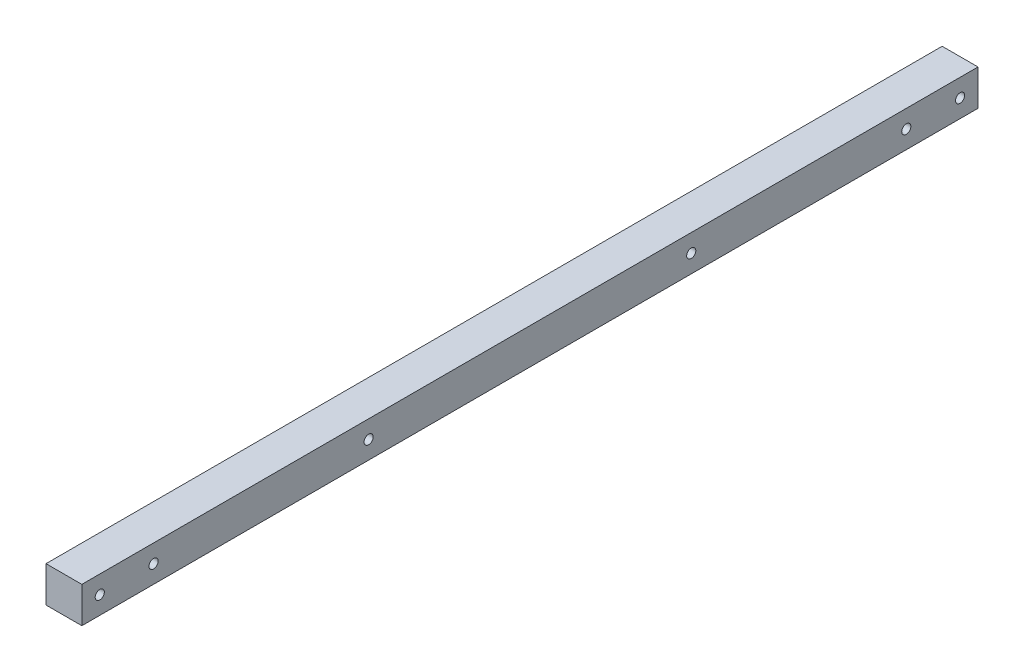
ISO-10303-21;
HEADER;
FILE_DESCRIPTION(('STEP AP214'),'2;1');
FILE_NAME('part.step','',(''),(''),'','','');
FILE_SCHEMA(('AUTOMOTIVE_DESIGN { 1 0 10303 214 1 1 1 1 }'));
ENDSEC;
DATA;
#1=APPLICATION_CONTEXT('core data for automotive mechanical design processes');
#2=APPLICATION_PROTOCOL_DEFINITION('international standard','automotive_design',2000,#1);
#3=PRODUCT_CONTEXT('',#1,'mechanical');
#4=PRODUCT('Part','Part','',(#3));
#5=PRODUCT_RELATED_PRODUCT_CATEGORY('part','',(#4));
#6=PRODUCT_DEFINITION_FORMATION('','',#4);
#7=PRODUCT_DEFINITION_CONTEXT('part definition',#1,'design');
#8=PRODUCT_DEFINITION('design','',#6,#7);
#9=PRODUCT_DEFINITION_SHAPE('','',#8);
#10=(LENGTH_UNIT() NAMED_UNIT(*) SI_UNIT(.MILLI.,.METRE.));
#11=(NAMED_UNIT(*) PLANE_ANGLE_UNIT() SI_UNIT($,.RADIAN.));
#12=(NAMED_UNIT(*) SI_UNIT($,.STERADIAN.) SOLID_ANGLE_UNIT());
#13=UNCERTAINTY_MEASURE_WITH_UNIT(LENGTH_MEASURE(1.E-05),#10,'distance_accuracy_value','');
#14=(GEOMETRIC_REPRESENTATION_CONTEXT(3) GLOBAL_UNCERTAINTY_ASSIGNED_CONTEXT((#13)) GLOBAL_UNIT_ASSIGNED_CONTEXT((#10,
#11,#12)) REPRESENTATION_CONTEXT('',''));
#15=CARTESIAN_POINT('',(0.,0.,0.));
#16=DIRECTION('',(0.,0.,1.));
#17=DIRECTION('',(1.,0.,0.));
#18=AXIS2_PLACEMENT_3D('',#15,#16,#17);
#19=CARTESIAN_POINT('',(-10.,-10.,500.));
#20=DIRECTION('',(0.,1.,0.));
#21=DIRECTION('',(0.,0.,1.));
#22=AXIS2_PLACEMENT_3D('',#19,#20,#21);
#23=PLANE('',#22);
#24=DIRECTION('',(0.,0.,-1.));
#25=VECTOR('',#24,1.);
#26=CARTESIAN_POINT('',(10.,-10.,500.));
#27=LINE('',#26,#25);
#28=CARTESIAN_POINT('',(10.,-10.,500.));
#29=VERTEX_POINT('',#28);
#30=CARTESIAN_POINT('',(10.,-10.,0.));
#31=VERTEX_POINT('',#30);
#32=EDGE_CURVE('E72',#29,#31,#27,.T.);
#33=ORIENTED_EDGE('',*,*,#32,.F.);
#34=DIRECTION('',(1.,0.,0.));
#35=VECTOR('',#34,1.);
#36=CARTESIAN_POINT('',(-240.,-10.,500.));
#37=LINE('',#36,#35);
#38=CARTESIAN_POINT('',(-10.,-10.,500.));
#39=VERTEX_POINT('',#38);
#40=EDGE_CURVE('E85',#39,#29,#37,.T.);
#41=ORIENTED_EDGE('',*,*,#40,.F.);
#42=DIRECTION('',(0.,0.,-1.));
#43=VECTOR('',#42,1.);
#44=CARTESIAN_POINT('',(-10.,-10.,500.));
#45=LINE('',#44,#43);
#46=CARTESIAN_POINT('',(-10.,-10.,0.));
#47=VERTEX_POINT('',#46);
#48=EDGE_CURVE('E78',#39,#47,#45,.T.);
#49=ORIENTED_EDGE('',*,*,#48,.T.);
#50=DIRECTION('',(1.,0.,0.));
#51=VECTOR('',#50,1.);
#52=CARTESIAN_POINT('',(-240.,-10.,0.));
#53=LINE('',#52,#51);
#54=EDGE_CURVE('E82',#47,#31,#53,.T.);
#55=ORIENTED_EDGE('',*,*,#54,.T.);
#56=EDGE_LOOP('',(#33,#41,#49,#55));
#57=FACE_BOUND('',#56,.T.);
#58=ADVANCED_FACE('F33',(#57),#23,.F.);
#59=CARTESIAN_POINT('',(10.,10.,500.));
#60=DIRECTION('',(-1.,0.,0.));
#61=DIRECTION('',(0.,0.,1.));
#62=AXIS2_PLACEMENT_3D('',#59,#60,#61);
#63=PLANE('',#62);
#64=CARTESIAN_POINT('',(10.,0.,160.));
#65=DIRECTION('',(1.,0.,0.));
#66=DIRECTION('',(0.,0.,-1.));
#67=AXIS2_PLACEMENT_3D('',#64,#65,#66);
#68=CIRCLE('',#67,2.54999999999999);
#69=CARTESIAN_POINT('',(9.99999999999999,0.,157.45));
#70=VERTEX_POINT('',#69);
#71=EDGE_CURVE('E140',#70,#70,#68,.T.);
#72=ORIENTED_EDGE('',*,*,#71,.F.);
#73=EDGE_LOOP('',(#72));
#74=FACE_BOUND('',#73,.T.);
#75=CARTESIAN_POINT('',(10.,0.,340.));
#76=DIRECTION('',(1.,0.,0.));
#77=DIRECTION('',(0.,0.,-1.));
#78=AXIS2_PLACEMENT_3D('',#75,#76,#77);
#79=CIRCLE('',#78,2.54999999999999);
#80=CARTESIAN_POINT('',(9.99999999999999,0.,337.45));
#81=VERTEX_POINT('',#80);
#82=EDGE_CURVE('E134',#81,#81,#79,.T.);
#83=ORIENTED_EDGE('',*,*,#82,.F.);
#84=EDGE_LOOP('',(#83));
#85=FACE_BOUND('',#84,.T.);
#86=CARTESIAN_POINT('',(10.,0.,40.));
#87=DIRECTION('',(1.,0.,0.));
#88=DIRECTION('',(0.,0.,-1.));
#89=AXIS2_PLACEMENT_3D('',#86,#87,#88);
#90=CIRCLE('',#89,2.55);
#91=CARTESIAN_POINT('',(10.,0.,37.45));
#92=VERTEX_POINT('',#91);
#93=EDGE_CURVE('E103',#92,#92,#90,.T.);
#94=ORIENTED_EDGE('',*,*,#93,.F.);
#95=EDGE_LOOP('',(#94));
#96=FACE_BOUND('',#95,.T.);
#97=CARTESIAN_POINT('',(10.,0.,10.));
#98=DIRECTION('',(1.,0.,0.));
#99=DIRECTION('',(0.,0.,-1.));
#100=AXIS2_PLACEMENT_3D('',#97,#98,#99);
#101=CIRCLE('',#100,2.55);
#102=CARTESIAN_POINT('',(10.,0.,7.45));
#103=VERTEX_POINT('',#102);
#104=EDGE_CURVE('E125',#103,#103,#101,.T.);
#105=ORIENTED_EDGE('',*,*,#104,.F.);
#106=EDGE_LOOP('',(#105));
#107=FACE_BOUND('',#106,.T.);
#108=CARTESIAN_POINT('',(10.,0.,460.));
#109=DIRECTION('',(1.,0.,0.));
#110=DIRECTION('',(0.,0.,-1.));
#111=AXIS2_PLACEMENT_3D('',#108,#109,#110);
#112=CIRCLE('',#111,2.54999999999999);
#113=CARTESIAN_POINT('',(10.,0.,457.45));
#114=VERTEX_POINT('',#113);
#115=EDGE_CURVE('E118',#114,#114,#112,.T.);
#116=ORIENTED_EDGE('',*,*,#115,.F.);
#117=EDGE_LOOP('',(#116));
#118=FACE_BOUND('',#117,.T.);
#119=CARTESIAN_POINT('',(10.,0.,490.));
#120=DIRECTION('',(1.,0.,0.));
#121=DIRECTION('',(0.,0.,-1.));
#122=AXIS2_PLACEMENT_3D('',#119,#120,#121);
#123=CIRCLE('',#122,2.54999999999999);
#124=CARTESIAN_POINT('',(10.,0.,487.45));
#125=VERTEX_POINT('',#124);
#126=EDGE_CURVE('E112',#125,#125,#123,.T.);
#127=ORIENTED_EDGE('',*,*,#126,.F.);
#128=EDGE_LOOP('',(#127));
#129=FACE_BOUND('',#128,.T.);
#130=ORIENTED_EDGE('',*,*,#32,.T.);
#131=DIRECTION('',(0.,1.,0.));
#132=VECTOR('',#131,1.);
#133=CARTESIAN_POINT('',(10.,10.,0.));
#134=LINE('',#133,#132);
#135=CARTESIAN_POINT('',(10.,10.,0.));
#136=VERTEX_POINT('',#135);
#137=EDGE_CURVE('E55',#31,#136,#134,.T.);
#138=ORIENTED_EDGE('',*,*,#137,.T.);
#139=DIRECTION('',(0.,0.,-1.));
#140=VECTOR('',#139,1.);
#141=CARTESIAN_POINT('',(10.,10.,500.));
#142=LINE('',#141,#140);
#143=CARTESIAN_POINT('',(10.,10.,500.));
#144=VERTEX_POINT('',#143);
#145=EDGE_CURVE('E11',#144,#136,#142,.T.);
#146=ORIENTED_EDGE('',*,*,#145,.F.);
#147=DIRECTION('',(0.,1.,0.));
#148=VECTOR('',#147,1.);
#149=CARTESIAN_POINT('',(10.,10.,500.));
#150=LINE('',#149,#148);
#151=EDGE_CURVE('E74',#29,#144,#150,.T.);
#152=ORIENTED_EDGE('',*,*,#151,.F.);
#153=EDGE_LOOP('',(#130,#138,#146,#152));
#154=FACE_BOUND('',#153,.T.);
#155=ADVANCED_FACE('F35',(#74,#85,#96,#107,#118,#129,#154),#63,.F.);
#156=CARTESIAN_POINT('',(-10.,10.,500.));
#157=DIRECTION('',(0.,-1.,0.));
#158=DIRECTION('',(0.,0.,-1.));
#159=AXIS2_PLACEMENT_3D('',#156,#157,#158);
#160=PLANE('',#159);
#161=DIRECTION('',(0.,0.,-1.));
#162=VECTOR('',#161,1.);
#163=CARTESIAN_POINT('',(-10.,10.,500.));
#164=LINE('',#163,#162);
#165=CARTESIAN_POINT('',(-10.,10.,500.));
#166=VERTEX_POINT('',#165);
#167=CARTESIAN_POINT('',(-10.,10.,0.));
#168=VERTEX_POINT('',#167);
#169=EDGE_CURVE('E41',#166,#168,#164,.T.);
#170=ORIENTED_EDGE('',*,*,#169,.F.);
#171=DIRECTION('',(-1.,0.,0.));
#172=VECTOR('',#171,1.);
#173=CARTESIAN_POINT('',(-10.,10.,500.));
#174=LINE('',#173,#172);
#175=EDGE_CURVE('E91',#144,#166,#174,.T.);
#176=ORIENTED_EDGE('',*,*,#175,.F.);
#177=ORIENTED_EDGE('',*,*,#145,.T.);
#178=DIRECTION('',(-1.,0.,0.));
#179=VECTOR('',#178,1.);
#180=CARTESIAN_POINT('',(-10.,10.,0.));
#181=LINE('',#180,#179);
#182=EDGE_CURVE('E90',#136,#168,#181,.T.);
#183=ORIENTED_EDGE('',*,*,#182,.T.);
#184=EDGE_LOOP('',(#170,#176,#177,#183));
#185=FACE_BOUND('',#184,.T.);
#186=ADVANCED_FACE('F149',(#185),#160,.F.);
#187=CARTESIAN_POINT('',(-10.,10.,500.));
#188=DIRECTION('',(1.,0.,0.));
#189=DIRECTION('',(0.,1.,0.));
#190=AXIS2_PLACEMENT_3D('',#187,#188,#189);
#191=PLANE('',#190);
#192=CARTESIAN_POINT('',(-10.,0.,160.));
#193=DIRECTION('',(1.,0.,0.));
#194=DIRECTION('',(0.,1.,0.));
#195=AXIS2_PLACEMENT_3D('',#192,#193,#194);
#196=CIRCLE('',#195,2.54999999999999);
#197=CARTESIAN_POINT('',(-10.,0.,157.45));
#198=VERTEX_POINT('',#197);
#199=EDGE_CURVE('E137',#198,#198,#196,.F.);
#200=ORIENTED_EDGE('',*,*,#199,.F.);
#201=EDGE_LOOP('',(#200));
#202=FACE_BOUND('',#201,.T.);
#203=CARTESIAN_POINT('',(-10.,0.,340.));
#204=DIRECTION('',(1.,0.,0.));
#205=DIRECTION('',(0.,1.,0.));
#206=AXIS2_PLACEMENT_3D('',#203,#204,#205);
#207=CIRCLE('',#206,2.54999999999999);
#208=CARTESIAN_POINT('',(-10.,0.,337.45));
#209=VERTEX_POINT('',#208);
#210=EDGE_CURVE('E86',#209,#209,#207,.F.);
#211=ORIENTED_EDGE('',*,*,#210,.F.);
#212=EDGE_LOOP('',(#211));
#213=FACE_BOUND('',#212,.T.);
#214=CARTESIAN_POINT('',(-10.,0.,40.));
#215=DIRECTION('',(1.,0.,0.));
#216=DIRECTION('',(0.,1.,0.));
#217=AXIS2_PLACEMENT_3D('',#214,#215,#216);
#218=CIRCLE('',#217,2.55);
#219=CARTESIAN_POINT('',(-10.,2.55,40.));
#220=VERTEX_POINT('',#219);
#221=EDGE_CURVE('E122',#220,#220,#218,.F.);
#222=ORIENTED_EDGE('',*,*,#221,.F.);
#223=EDGE_LOOP('',(#222));
#224=FACE_BOUND('',#223,.T.);
#225=CARTESIAN_POINT('',(-10.,0.,10.));
#226=DIRECTION('',(1.,0.,0.));
#227=DIRECTION('',(0.,1.,0.));
#228=AXIS2_PLACEMENT_3D('',#225,#226,#227);
#229=CIRCLE('',#228,2.55);
#230=CARTESIAN_POINT('',(-10.,2.55,10.));
#231=VERTEX_POINT('',#230);
#232=EDGE_CURVE('E121',#231,#231,#229,.F.);
#233=ORIENTED_EDGE('',*,*,#232,.F.);
#234=EDGE_LOOP('',(#233));
#235=FACE_BOUND('',#234,.T.);
#236=CARTESIAN_POINT('',(-10.,0.,460.));
#237=DIRECTION('',(1.,0.,0.));
#238=DIRECTION('',(0.,1.,0.));
#239=AXIS2_PLACEMENT_3D('',#236,#237,#238);
#240=CIRCLE('',#239,2.54999999999999);
#241=CARTESIAN_POINT('',(-10.,2.54999999999999,460.));
#242=VERTEX_POINT('',#241);
#243=EDGE_CURVE('E115',#242,#242,#240,.F.);
#244=ORIENTED_EDGE('',*,*,#243,.F.);
#245=EDGE_LOOP('',(#244));
#246=FACE_BOUND('',#245,.T.);
#247=CARTESIAN_POINT('',(-10.,0.,490.));
#248=DIRECTION('',(1.,0.,0.));
#249=DIRECTION('',(0.,1.,0.));
#250=AXIS2_PLACEMENT_3D('',#247,#248,#249);
#251=CIRCLE('',#250,2.54999999999999);
#252=CARTESIAN_POINT('',(-10.,2.54999999999999,490.));
#253=VERTEX_POINT('',#252);
#254=EDGE_CURVE('E107',#253,#253,#251,.F.);
#255=ORIENTED_EDGE('',*,*,#254,.F.);
#256=EDGE_LOOP('',(#255));
#257=FACE_BOUND('',#256,.T.);
#258=DIRECTION('',(0.,-1.,0.));
#259=VECTOR('',#258,1.);
#260=CARTESIAN_POINT('',(-10.,10.,0.));
#261=LINE('',#260,#259);
#262=EDGE_CURVE('E79',#168,#47,#261,.T.);
#263=ORIENTED_EDGE('',*,*,#262,.T.);
#264=ORIENTED_EDGE('',*,*,#48,.F.);
#265=DIRECTION('',(0.,-1.,0.));
#266=VECTOR('',#265,1.);
#267=CARTESIAN_POINT('',(-10.,10.,500.));
#268=LINE('',#267,#266);
#269=EDGE_CURVE('E95',#166,#39,#268,.T.);
#270=ORIENTED_EDGE('',*,*,#269,.F.);
#271=ORIENTED_EDGE('',*,*,#169,.T.);
#272=EDGE_LOOP('',(#263,#264,#270,#271));
#273=FACE_BOUND('',#272,.T.);
#274=ADVANCED_FACE('F100',(#202,#213,#224,#235,#246,#257,#273),#191,.F.);
#275=CARTESIAN_POINT('',(0.,0.,0.));
#276=DIRECTION('',(0.,0.,1.));
#277=DIRECTION('',(1.,0.,0.));
#278=AXIS2_PLACEMENT_3D('',#275,#276,#277);
#279=PLANE('',#278);
#280=ORIENTED_EDGE('',*,*,#137,.F.);
#281=ORIENTED_EDGE('',*,*,#54,.F.);
#282=ORIENTED_EDGE('',*,*,#262,.F.);
#283=ORIENTED_EDGE('',*,*,#182,.F.);
#284=EDGE_LOOP('',(#280,#281,#282,#283));
#285=FACE_BOUND('',#284,.T.);
#286=ADVANCED_FACE('F89',(#285),#279,.F.);
#287=CARTESIAN_POINT('',(0.,0.,500.));
#288=DIRECTION('',(0.,0.,-1.));
#289=DIRECTION('',(1.,0.,0.));
#290=AXIS2_PLACEMENT_3D('',#287,#288,#289);
#291=PLANE('',#290);
#292=ORIENTED_EDGE('',*,*,#269,.T.);
#293=ORIENTED_EDGE('',*,*,#40,.T.);
#294=ORIENTED_EDGE('',*,*,#151,.T.);
#295=ORIENTED_EDGE('',*,*,#175,.T.);
#296=EDGE_LOOP('',(#292,#293,#294,#295));
#297=FACE_BOUND('',#296,.T.);
#298=ADVANCED_FACE('F105',(#297),#291,.F.);
#299=CARTESIAN_POINT('',(-10.001,0.,490.));
#300=DIRECTION('',(1.,0.,0.));
#301=DIRECTION('',(0.,0.,-1.));
#302=AXIS2_PLACEMENT_3D('',#299,#300,#301);
#303=CYLINDRICAL_SURFACE('',#302,2.54999999999999);
#304=ORIENTED_EDGE('',*,*,#126,.T.);
#305=EDGE_LOOP('',(#304));
#306=FACE_BOUND('',#305,.T.);
#307=ORIENTED_EDGE('',*,*,#254,.T.);
#308=EDGE_LOOP('',(#307));
#309=FACE_BOUND('',#308,.T.);
#310=ADVANCED_FACE('F160',(#306,#309),#303,.F.);
#311=CARTESIAN_POINT('',(-10.001,0.,460.));
#312=DIRECTION('',(1.,0.,0.));
#313=DIRECTION('',(0.,0.,-1.));
#314=AXIS2_PLACEMENT_3D('',#311,#312,#313);
#315=CYLINDRICAL_SURFACE('',#314,2.54999999999999);
#316=ORIENTED_EDGE('',*,*,#115,.T.);
#317=EDGE_LOOP('',(#316));
#318=FACE_BOUND('',#317,.T.);
#319=ORIENTED_EDGE('',*,*,#243,.T.);
#320=EDGE_LOOP('',(#319));
#321=FACE_BOUND('',#320,.T.);
#322=ADVANCED_FACE('F163',(#318,#321),#315,.F.);
#323=CARTESIAN_POINT('',(-10.001,0.,10.));
#324=DIRECTION('',(1.,0.,0.));
#325=DIRECTION('',(0.,0.,-1.));
#326=AXIS2_PLACEMENT_3D('',#323,#324,#325);
#327=CYLINDRICAL_SURFACE('',#326,2.55);
#328=ORIENTED_EDGE('',*,*,#104,.T.);
#329=EDGE_LOOP('',(#328));
#330=FACE_BOUND('',#329,.T.);
#331=ORIENTED_EDGE('',*,*,#232,.T.);
#332=EDGE_LOOP('',(#331));
#333=FACE_BOUND('',#332,.T.);
#334=ADVANCED_FACE('F190',(#330,#333),#327,.F.);
#335=CARTESIAN_POINT('',(-10.001,0.,40.));
#336=DIRECTION('',(1.,0.,0.));
#337=DIRECTION('',(0.,0.,-1.));
#338=AXIS2_PLACEMENT_3D('',#335,#336,#337);
#339=CYLINDRICAL_SURFACE('',#338,2.55);
#340=ORIENTED_EDGE('',*,*,#93,.T.);
#341=EDGE_LOOP('',(#340));
#342=FACE_BOUND('',#341,.T.);
#343=ORIENTED_EDGE('',*,*,#221,.T.);
#344=EDGE_LOOP('',(#343));
#345=FACE_BOUND('',#344,.T.);
#346=ADVANCED_FACE('F192',(#342,#345),#339,.F.);
#347=CARTESIAN_POINT('',(-10.001,0.,340.));
#348=DIRECTION('',(1.,0.,0.));
#349=DIRECTION('',(0.,0.,-1.));
#350=AXIS2_PLACEMENT_3D('',#347,#348,#349);
#351=CYLINDRICAL_SURFACE('',#350,2.54999999999999);
#352=CARTESIAN_POINT('',(9.99999999999999,0.,337.45));
#353=CARTESIAN_POINT('',(9.79166666666666,0.,337.45));
#354=CARTESIAN_POINT('',(9.58333333333333,0.,337.45));
#355=CARTESIAN_POINT('',(9.16666666666666,0.,337.45));
#356=CARTESIAN_POINT('',(8.95833333333333,0.,337.45));
#357=CARTESIAN_POINT('',(8.54166666666666,0.,337.45));
#358=CARTESIAN_POINT('',(8.33333333333333,0.,337.45));
#359=CARTESIAN_POINT('',(7.91666666666666,0.,337.45));
#360=CARTESIAN_POINT('',(7.70833333333333,0.,337.45));
#361=CARTESIAN_POINT('',(7.29166666666666,0.,337.45));
#362=CARTESIAN_POINT('',(7.08333333333333,0.,337.45));
#363=CARTESIAN_POINT('',(6.66666666666666,0.,337.45));
#364=CARTESIAN_POINT('',(6.45833333333333,0.,337.45));
#365=CARTESIAN_POINT('',(6.04166666666666,0.,337.45));
#366=CARTESIAN_POINT('',(5.83333333333333,0.,337.45));
#367=CARTESIAN_POINT('',(5.41666666666666,0.,337.45));
#368=CARTESIAN_POINT('',(5.20833333333333,0.,337.45));
#369=CARTESIAN_POINT('',(4.79166666666666,0.,337.45));
#370=CARTESIAN_POINT('',(4.58333333333333,0.,337.45));
#371=CARTESIAN_POINT('',(4.16666666666666,0.,337.45));
#372=CARTESIAN_POINT('',(3.95833333333333,0.,337.45));
#373=CARTESIAN_POINT('',(3.54166666666666,0.,337.45));
#374=CARTESIAN_POINT('',(3.33333333333333,0.,337.45));
#375=CARTESIAN_POINT('',(2.91666666666666,0.,337.45));
#376=CARTESIAN_POINT('',(2.70833333333333,0.,337.45));
#377=CARTESIAN_POINT('',(2.29166666666666,0.,337.45));
#378=CARTESIAN_POINT('',(2.08333333333333,0.,337.45));
#379=CARTESIAN_POINT('',(1.66666666666666,0.,337.45));
#380=CARTESIAN_POINT('',(1.45833333333333,0.,337.45));
#381=CARTESIAN_POINT('',(1.04166666666666,0.,337.45));
#382=CARTESIAN_POINT('',(0.83333333333333,0.,337.45));
#383=CARTESIAN_POINT('',(0.416666666666664,0.,337.45));
#384=CARTESIAN_POINT('',(0.20833333333333,0.,337.45));
#385=CARTESIAN_POINT('',(-0.208333333333337,0.,337.45));
#386=CARTESIAN_POINT('',(-0.41666666666667,0.,337.45));
#387=CARTESIAN_POINT('',(-0.833333333333337,0.,337.45));
#388=CARTESIAN_POINT('',(-1.04166666666667,0.,337.45));
#389=CARTESIAN_POINT('',(-1.45833333333334,0.,337.45));
#390=CARTESIAN_POINT('',(-1.66666666666667,0.,337.45));
#391=CARTESIAN_POINT('',(-2.08333333333334,0.,337.45));
#392=CARTESIAN_POINT('',(-2.29166666666667,0.,337.45));
#393=CARTESIAN_POINT('',(-2.70833333333334,0.,337.45));
#394=CARTESIAN_POINT('',(-2.91666666666667,0.,337.45));
#395=CARTESIAN_POINT('',(-3.33333333333334,0.,337.45));
#396=CARTESIAN_POINT('',(-3.54166666666667,0.,337.45));
#397=CARTESIAN_POINT('',(-3.95833333333334,0.,337.45));
#398=CARTESIAN_POINT('',(-4.16666666666667,0.,337.45));
#399=CARTESIAN_POINT('',(-4.58333333333334,0.,337.45));
#400=CARTESIAN_POINT('',(-4.79166666666667,0.,337.45));
#401=CARTESIAN_POINT('',(-5.20833333333334,0.,337.45));
#402=CARTESIAN_POINT('',(-5.41666666666667,0.,337.45));
#403=CARTESIAN_POINT('',(-5.83333333333334,0.,337.45));
#404=CARTESIAN_POINT('',(-6.04166666666667,0.,337.45));
#405=CARTESIAN_POINT('',(-6.45833333333334,0.,337.45));
#406=CARTESIAN_POINT('',(-6.66666666666667,0.,337.45));
#407=CARTESIAN_POINT('',(-7.08333333333334,0.,337.45));
#408=CARTESIAN_POINT('',(-7.29166666666667,0.,337.45));
#409=CARTESIAN_POINT('',(-7.70833333333334,0.,337.45));
#410=CARTESIAN_POINT('',(-7.91666666666667,0.,337.45));
#411=CARTESIAN_POINT('',(-8.33333333333333,0.,337.45));
#412=CARTESIAN_POINT('',(-8.54166666666667,0.,337.45));
#413=CARTESIAN_POINT('',(-8.95833333333333,0.,337.45));
#414=CARTESIAN_POINT('',(-9.16666666666667,0.,337.45));
#415=CARTESIAN_POINT('',(-9.58333333333333,0.,337.45));
#416=CARTESIAN_POINT('',(-9.79166666666667,0.,337.45));
#417=CARTESIAN_POINT('',(-10.,0.,337.45));
#418=B_SPLINE_CURVE_WITH_KNOTS('',3,(#352,#353,#354,#355,#356,#357,#358,#359,#360,#361,#362,
#363,#364,#365,#366,#367,#368,#369,#370,#371,#372,#373,#374,#375,#376,#377,#378,#379,#380,#381,
#382,#383,#384,#385,#386,#387,#388,#389,#390,#391,#392,#393,#394,#395,#396,#397,#398,#399,#400,
#401,#402,#403,#404,#405,#406,#407,#408,#409,#410,#411,#412,#413,#414,#415,#416,#417),
.UNSPECIFIED.,.F.,.F.,(4,2,2,2,2,2,2,2,2,2,2,2,2,2,2,2,2,2,2,2,2,2,2,2,2,2,2,2,2,2,2,2,4),(0.,
0.625000000000001,1.25,1.875,2.5,3.125,3.75,4.375,5.,5.625,6.25,6.875,7.5,8.125,8.75,9.375,10.,
10.625,11.25,11.875,12.5,13.125,13.75,14.375,15.,15.625,16.25,16.875,17.5,18.125,18.75,19.375,
20.),.UNSPECIFIED.);
#419=EDGE_CURVE('BSEAM194',#81,#209,#418,.T.);
#420=ORIENTED_EDGE('',*,*,#82,.T.);
#421=ORIENTED_EDGE('',*,*,#210,.T.);
#422=ORIENTED_EDGE('',*,*,#419,.T.);
#423=ORIENTED_EDGE('',*,*,#419,.F.);
#424=EDGE_LOOP('',(#420,#422,#421,#423));
#425=FACE_BOUND('',#424,.T.);
#426=ADVANCED_FACE('F194',(#425),#351,.F.);
#427=CARTESIAN_POINT('',(-10.001,0.,160.));
#428=DIRECTION('',(1.,0.,0.));
#429=DIRECTION('',(0.,0.,-1.));
#430=AXIS2_PLACEMENT_3D('',#427,#428,#429);
#431=CYLINDRICAL_SURFACE('',#430,2.54999999999999);
#432=CARTESIAN_POINT('',(9.99999999999999,0.,157.45));
#433=CARTESIAN_POINT('',(9.79166666666666,0.,157.45));
#434=CARTESIAN_POINT('',(9.58333333333333,0.,157.45));
#435=CARTESIAN_POINT('',(9.16666666666666,0.,157.45));
#436=CARTESIAN_POINT('',(8.95833333333333,0.,157.45));
#437=CARTESIAN_POINT('',(8.54166666666666,0.,157.45));
#438=CARTESIAN_POINT('',(8.33333333333333,0.,157.45));
#439=CARTESIAN_POINT('',(7.91666666666666,0.,157.45));
#440=CARTESIAN_POINT('',(7.70833333333333,0.,157.45));
#441=CARTESIAN_POINT('',(7.29166666666666,0.,157.45));
#442=CARTESIAN_POINT('',(7.08333333333333,0.,157.45));
#443=CARTESIAN_POINT('',(6.66666666666666,0.,157.45));
#444=CARTESIAN_POINT('',(6.45833333333333,0.,157.45));
#445=CARTESIAN_POINT('',(6.04166666666666,0.,157.45));
#446=CARTESIAN_POINT('',(5.83333333333333,0.,157.45));
#447=CARTESIAN_POINT('',(5.41666666666666,0.,157.45));
#448=CARTESIAN_POINT('',(5.20833333333333,0.,157.45));
#449=CARTESIAN_POINT('',(4.79166666666666,0.,157.45));
#450=CARTESIAN_POINT('',(4.58333333333333,0.,157.45));
#451=CARTESIAN_POINT('',(4.16666666666666,0.,157.45));
#452=CARTESIAN_POINT('',(3.95833333333333,0.,157.45));
#453=CARTESIAN_POINT('',(3.54166666666666,0.,157.45));
#454=CARTESIAN_POINT('',(3.33333333333333,0.,157.45));
#455=CARTESIAN_POINT('',(2.91666666666666,0.,157.45));
#456=CARTESIAN_POINT('',(2.70833333333333,0.,157.45));
#457=CARTESIAN_POINT('',(2.29166666666666,0.,157.45));
#458=CARTESIAN_POINT('',(2.08333333333333,0.,157.45));
#459=CARTESIAN_POINT('',(1.66666666666666,0.,157.45));
#460=CARTESIAN_POINT('',(1.45833333333333,0.,157.45));
#461=CARTESIAN_POINT('',(1.04166666666666,0.,157.45));
#462=CARTESIAN_POINT('',(0.83333333333333,0.,157.45));
#463=CARTESIAN_POINT('',(0.416666666666664,0.,157.45));
#464=CARTESIAN_POINT('',(0.20833333333333,0.,157.45));
#465=CARTESIAN_POINT('',(-0.208333333333337,0.,157.45));
#466=CARTESIAN_POINT('',(-0.41666666666667,0.,157.45));
#467=CARTESIAN_POINT('',(-0.833333333333337,0.,157.45));
#468=CARTESIAN_POINT('',(-1.04166666666667,0.,157.45));
#469=CARTESIAN_POINT('',(-1.45833333333334,0.,157.45));
#470=CARTESIAN_POINT('',(-1.66666666666667,0.,157.45));
#471=CARTESIAN_POINT('',(-2.08333333333334,0.,157.45));
#472=CARTESIAN_POINT('',(-2.29166666666667,0.,157.45));
#473=CARTESIAN_POINT('',(-2.70833333333334,0.,157.45));
#474=CARTESIAN_POINT('',(-2.91666666666667,0.,157.45));
#475=CARTESIAN_POINT('',(-3.33333333333334,0.,157.45));
#476=CARTESIAN_POINT('',(-3.54166666666667,0.,157.45));
#477=CARTESIAN_POINT('',(-3.95833333333334,0.,157.45));
#478=CARTESIAN_POINT('',(-4.16666666666667,0.,157.45));
#479=CARTESIAN_POINT('',(-4.58333333333334,0.,157.45));
#480=CARTESIAN_POINT('',(-4.79166666666667,0.,157.45));
#481=CARTESIAN_POINT('',(-5.20833333333334,0.,157.45));
#482=CARTESIAN_POINT('',(-5.41666666666667,0.,157.45));
#483=CARTESIAN_POINT('',(-5.83333333333334,0.,157.45));
#484=CARTESIAN_POINT('',(-6.04166666666667,0.,157.45));
#485=CARTESIAN_POINT('',(-6.45833333333334,0.,157.45));
#486=CARTESIAN_POINT('',(-6.66666666666667,0.,157.45));
#487=CARTESIAN_POINT('',(-7.08333333333334,0.,157.45));
#488=CARTESIAN_POINT('',(-7.29166666666667,0.,157.45));
#489=CARTESIAN_POINT('',(-7.70833333333334,0.,157.45));
#490=CARTESIAN_POINT('',(-7.91666666666667,0.,157.45));
#491=CARTESIAN_POINT('',(-8.33333333333333,0.,157.45));
#492=CARTESIAN_POINT('',(-8.54166666666667,0.,157.45));
#493=CARTESIAN_POINT('',(-8.95833333333333,0.,157.45));
#494=CARTESIAN_POINT('',(-9.16666666666667,0.,157.45));
#495=CARTESIAN_POINT('',(-9.58333333333333,0.,157.45));
#496=CARTESIAN_POINT('',(-9.79166666666667,0.,157.45));
#497=CARTESIAN_POINT('',(-10.,0.,157.45));
#498=B_SPLINE_CURVE_WITH_KNOTS('',3,(#432,#433,#434,#435,#436,#437,#438,#439,#440,#441,#442,
#443,#444,#445,#446,#447,#448,#449,#450,#451,#452,#453,#454,#455,#456,#457,#458,#459,#460,#461,
#462,#463,#464,#465,#466,#467,#468,#469,#470,#471,#472,#473,#474,#475,#476,#477,#478,#479,#480,
#481,#482,#483,#484,#485,#486,#487,#488,#489,#490,#491,#492,#493,#494,#495,#496,#497),
.UNSPECIFIED.,.F.,.F.,(4,2,2,2,2,2,2,2,2,2,2,2,2,2,2,2,2,2,2,2,2,2,2,2,2,2,2,2,2,2,2,2,4),(0.,
0.625000000000001,1.25,1.875,2.5,3.125,3.75,4.375,5.,5.625,6.25,6.875,7.5,8.125,8.75,9.375,10.,
10.625,11.25,11.875,12.5,13.125,13.75,14.375,15.,15.625,16.25,16.875,17.5,18.125,18.75,19.375,
20.),.UNSPECIFIED.);
#499=EDGE_CURVE('BSEAM144',#70,#198,#498,.T.);
#500=ORIENTED_EDGE('',*,*,#71,.T.);
#501=ORIENTED_EDGE('',*,*,#199,.T.);
#502=ORIENTED_EDGE('',*,*,#499,.T.);
#503=ORIENTED_EDGE('',*,*,#499,.F.);
#504=EDGE_LOOP('',(#500,#502,#501,#503));
#505=FACE_BOUND('',#504,.T.);
#506=ADVANCED_FACE('F144',(#505),#431,.F.);
#507=CLOSED_SHELL('',(#58,#155,#186,#274,#286,#298,#310,#322,#334,#346,#426,#506));
#508=MANIFOLD_SOLID_BREP('B2',#507);
#509=ADVANCED_BREP_SHAPE_REPRESENTATION('',(#18,#508),#14);
#510=SHAPE_DEFINITION_REPRESENTATION(#9,#509);
ENDSEC;
END-ISO-10303-21;
